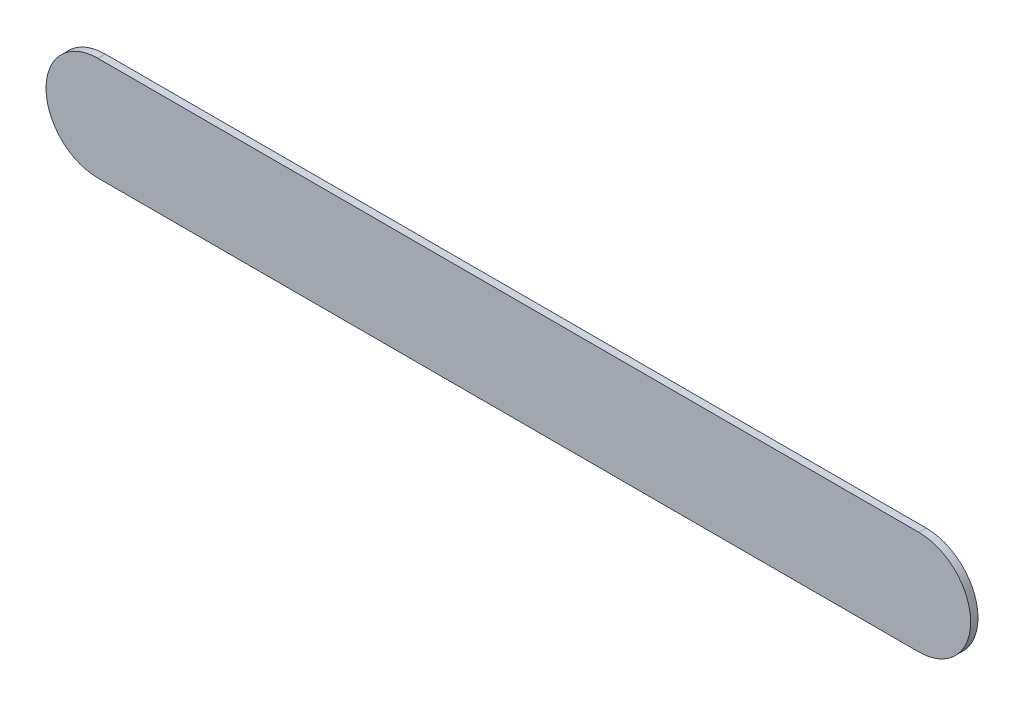
ISO-10303-21;
HEADER;
FILE_DESCRIPTION(('STEP AP214'),'2;1');
FILE_NAME('part.step','',(''),(''),'','','');
FILE_SCHEMA(('AUTOMOTIVE_DESIGN { 1 0 10303 214 1 1 1 1 }'));
ENDSEC;
DATA;
#1=APPLICATION_CONTEXT('core data for automotive mechanical design processes');
#2=APPLICATION_PROTOCOL_DEFINITION('international standard','automotive_design',2000,#1);
#3=PRODUCT_CONTEXT('',#1,'mechanical');
#4=PRODUCT('Part','Part','',(#3));
#5=PRODUCT_RELATED_PRODUCT_CATEGORY('part','',(#4));
#6=PRODUCT_DEFINITION_FORMATION('','',#4);
#7=PRODUCT_DEFINITION_CONTEXT('part definition',#1,'design');
#8=PRODUCT_DEFINITION('design','',#6,#7);
#9=PRODUCT_DEFINITION_SHAPE('','',#8);
#10=(LENGTH_UNIT() NAMED_UNIT(*) SI_UNIT(.MILLI.,.METRE.));
#11=(NAMED_UNIT(*) PLANE_ANGLE_UNIT() SI_UNIT($,.RADIAN.));
#12=(NAMED_UNIT(*) SI_UNIT($,.STERADIAN.) SOLID_ANGLE_UNIT());
#13=UNCERTAINTY_MEASURE_WITH_UNIT(LENGTH_MEASURE(1.E-05),#10,'distance_accuracy_value','');
#14=(GEOMETRIC_REPRESENTATION_CONTEXT(3) GLOBAL_UNCERTAINTY_ASSIGNED_CONTEXT((#13)) GLOBAL_UNIT_ASSIGNED_CONTEXT((#10,
#11,#12)) REPRESENTATION_CONTEXT('',''));
#15=CARTESIAN_POINT('',(0.,0.,0.));
#16=DIRECTION('',(0.,0.,1.));
#17=DIRECTION('',(1.,0.,0.));
#18=AXIS2_PLACEMENT_3D('',#15,#16,#17);
#19=CARTESIAN_POINT('',(111.40000326,66.75000112,0.));
#20=DIRECTION('',(0.,1.,0.));
#21=DIRECTION('',(1.,0.,0.));
#22=AXIS2_PLACEMENT_3D('',#19,#20,#21);
#23=PLANE('',#22);
#24=DIRECTION('',(1.,0.,0.));
#25=VECTOR('',#24,1.);
#26=CARTESIAN_POINT('',(111.40000326,66.75000112,0.03556));
#27=LINE('',#26,#25);
#28=CARTESIAN_POINT('',(111.40000326,66.75000112,0.03556));
#29=VERTEX_POINT('',#28);
#30=CARTESIAN_POINT('',(115.36001058,66.75000112,0.03556));
#31=VERTEX_POINT('',#30);
#32=EDGE_CURVE('E11',#29,#31,#27,.T.);
#33=ORIENTED_EDGE('',*,*,#32,.F.);
#34=DIRECTION('',(0.,0.,1.));
#35=VECTOR('',#34,1.);
#36=CARTESIAN_POINT('',(111.40000326,66.75000112,0.));
#37=LINE('',#36,#35);
#38=CARTESIAN_POINT('',(111.40000326,66.75000112,0.));
#39=VERTEX_POINT('',#38);
#40=EDGE_CURVE('E24',#39,#29,#37,.T.);
#41=ORIENTED_EDGE('',*,*,#40,.F.);
#42=DIRECTION('',(1.,0.,0.));
#43=VECTOR('',#42,1.);
#44=CARTESIAN_POINT('',(111.40000326,66.75000112,0.));
#45=LINE('',#44,#43);
#46=CARTESIAN_POINT('',(115.36001058,66.75000112,0.));
#47=VERTEX_POINT('',#46);
#48=EDGE_CURVE('E75',#39,#47,#45,.T.);
#49=ORIENTED_EDGE('',*,*,#48,.T.);
#50=DIRECTION('',(0.,0.,1.));
#51=VECTOR('',#50,1.);
#52=CARTESIAN_POINT('',(115.36001058,66.75000112,0.));
#53=LINE('',#52,#51);
#54=EDGE_CURVE('E37',#47,#31,#53,.T.);
#55=ORIENTED_EDGE('',*,*,#54,.T.);
#56=EDGE_LOOP('',(#33,#41,#49,#55));
#57=FACE_BOUND('',#56,.T.);
#58=ADVANCED_FACE('F17',(#57),#23,.F.);
#59=CARTESIAN_POINT('',(115.36001058,67.00000062,0.));
#60=DIRECTION('',(0.,0.,-1.));
#61=DIRECTION('',(1.13687065095746E-13,-1.,0.));
#62=AXIS2_PLACEMENT_3D('',#59,#60,#61);
#63=CYLINDRICAL_SURFACE('',#62,0.249999500000006);
#64=CARTESIAN_POINT('',(115.36001058,67.00000062,0.03556));
#65=DIRECTION('',(0.,0.,1.));
#66=DIRECTION('',(1.13687065095746E-13,-1.,0.));
#67=AXIS2_PLACEMENT_3D('',#64,#65,#66);
#68=CIRCLE('',#67,0.249999500000006);
#69=CARTESIAN_POINT('',(115.36001058,67.25000012,0.03556));
#70=VERTEX_POINT('',#69);
#71=EDGE_CURVE('E83',#31,#70,#68,.T.);
#72=ORIENTED_EDGE('',*,*,#71,.F.);
#73=ORIENTED_EDGE('',*,*,#54,.F.);
#74=CARTESIAN_POINT('',(115.36001058,67.00000062,0.));
#75=DIRECTION('',(0.,0.,1.));
#76=DIRECTION('',(1.13687065095746E-13,-1.,0.));
#77=AXIS2_PLACEMENT_3D('',#74,#75,#76);
#78=CIRCLE('',#77,0.249999500000006);
#79=CARTESIAN_POINT('',(115.36001058,67.25000012,0.));
#80=VERTEX_POINT('',#79);
#81=EDGE_CURVE('E81',#47,#80,#78,.T.);
#82=ORIENTED_EDGE('',*,*,#81,.T.);
#83=DIRECTION('',(0.,0.,1.));
#84=VECTOR('',#83,1.);
#85=CARTESIAN_POINT('',(115.36001058,67.25000012,0.));
#86=LINE('',#85,#84);
#87=EDGE_CURVE('E67',#80,#70,#86,.T.);
#88=ORIENTED_EDGE('',*,*,#87,.T.);
#89=EDGE_LOOP('',(#72,#73,#82,#88));
#90=FACE_BOUND('',#89,.T.);
#91=ADVANCED_FACE('F89',(#90),#63,.T.);
#92=CARTESIAN_POINT('',(115.36001058,67.25000012,0.));
#93=DIRECTION('',(0.,-1.,0.));
#94=DIRECTION('',(-1.,0.,0.));
#95=AXIS2_PLACEMENT_3D('',#92,#93,#94);
#96=PLANE('',#95);
#97=DIRECTION('',(-1.,0.,0.));
#98=VECTOR('',#97,1.);
#99=CARTESIAN_POINT('',(115.36001058,67.25000012,0.03556));
#100=LINE('',#99,#98);
#101=CARTESIAN_POINT('',(111.40000326,67.25000012,0.03556));
#102=VERTEX_POINT('',#101);
#103=EDGE_CURVE('E71',#70,#102,#100,.T.);
#104=ORIENTED_EDGE('',*,*,#103,.F.);
#105=ORIENTED_EDGE('',*,*,#87,.F.);
#106=DIRECTION('',(-1.,0.,0.));
#107=VECTOR('',#106,1.);
#108=CARTESIAN_POINT('',(115.36001058,67.25000012,0.));
#109=LINE('',#108,#107);
#110=CARTESIAN_POINT('',(111.40000326,67.25000012,0.));
#111=VERTEX_POINT('',#110);
#112=EDGE_CURVE('E63',#80,#111,#109,.T.);
#113=ORIENTED_EDGE('',*,*,#112,.T.);
#114=DIRECTION('',(0.,0.,1.));
#115=VECTOR('',#114,1.);
#116=CARTESIAN_POINT('',(111.40000326,67.25000012,0.));
#117=LINE('',#116,#115);
#118=EDGE_CURVE('E53',#111,#102,#117,.T.);
#119=ORIENTED_EDGE('',*,*,#118,.T.);
#120=EDGE_LOOP('',(#104,#105,#113,#119));
#121=FACE_BOUND('',#120,.T.);
#122=ADVANCED_FACE('F66',(#121),#96,.F.);
#123=CARTESIAN_POINT('',(111.40000326,67.00000062,0.));
#124=DIRECTION('',(0.,0.,-1.));
#125=DIRECTION('',(0.,1.,0.));
#126=AXIS2_PLACEMENT_3D('',#123,#124,#125);
#127=CYLINDRICAL_SURFACE('',#126,0.249999500000006);
#128=CARTESIAN_POINT('',(111.40000326,67.00000062,0.03556));
#129=DIRECTION('',(0.,0.,1.));
#130=DIRECTION('',(0.,1.,0.));
#131=AXIS2_PLACEMENT_3D('',#128,#129,#130);
#132=CIRCLE('',#131,0.249999500000006);
#133=EDGE_CURVE('E59',#102,#29,#132,.T.);
#134=ORIENTED_EDGE('',*,*,#133,.F.);
#135=ORIENTED_EDGE('',*,*,#118,.F.);
#136=CARTESIAN_POINT('',(111.40000326,67.00000062,0.));
#137=DIRECTION('',(0.,0.,1.));
#138=DIRECTION('',(0.,1.,0.));
#139=AXIS2_PLACEMENT_3D('',#136,#137,#138);
#140=CIRCLE('',#139,0.249999500000006);
#141=EDGE_CURVE('E57',#111,#39,#140,.T.);
#142=ORIENTED_EDGE('',*,*,#141,.T.);
#143=ORIENTED_EDGE('',*,*,#40,.T.);
#144=EDGE_LOOP('',(#134,#135,#142,#143));
#145=FACE_BOUND('',#144,.T.);
#146=ADVANCED_FACE('F55',(#145),#127,.T.);
#147=CARTESIAN_POINT('',(111.40000326,66.75000112,0.));
#148=DIRECTION('',(0.,0.,-1.));
#149=DIRECTION('',(-1.,0.,0.));
#150=AXIS2_PLACEMENT_3D('',#147,#148,#149);
#151=PLANE('',#150);
#152=ORIENTED_EDGE('',*,*,#141,.F.);
#153=ORIENTED_EDGE('',*,*,#112,.F.);
#154=ORIENTED_EDGE('',*,*,#81,.F.);
#155=ORIENTED_EDGE('',*,*,#48,.F.);
#156=EDGE_LOOP('',(#152,#153,#154,#155));
#157=FACE_BOUND('',#156,.T.);
#158=ADVANCED_FACE('F74',(#157),#151,.T.);
#159=CARTESIAN_POINT('',(111.40000326,66.75000112,0.03556));
#160=DIRECTION('',(0.,0.,-1.));
#161=DIRECTION('',(-1.,0.,0.));
#162=AXIS2_PLACEMENT_3D('',#159,#160,#161);
#163=PLANE('',#162);
#164=ORIENTED_EDGE('',*,*,#32,.T.);
#165=ORIENTED_EDGE('',*,*,#71,.T.);
#166=ORIENTED_EDGE('',*,*,#103,.T.);
#167=ORIENTED_EDGE('',*,*,#133,.T.);
#168=EDGE_LOOP('',(#164,#165,#166,#167));
#169=FACE_BOUND('',#168,.T.);
#170=ADVANCED_FACE('F91',(#169),#163,.F.);
#171=CLOSED_SHELL('',(#58,#91,#122,#146,#158,#170));
#172=MANIFOLD_SOLID_BREP('B1',#171);
#173=ADVANCED_BREP_SHAPE_REPRESENTATION('',(#18,#172),#14);
#174=SHAPE_DEFINITION_REPRESENTATION(#9,#173);
ENDSEC;
END-ISO-10303-21;
